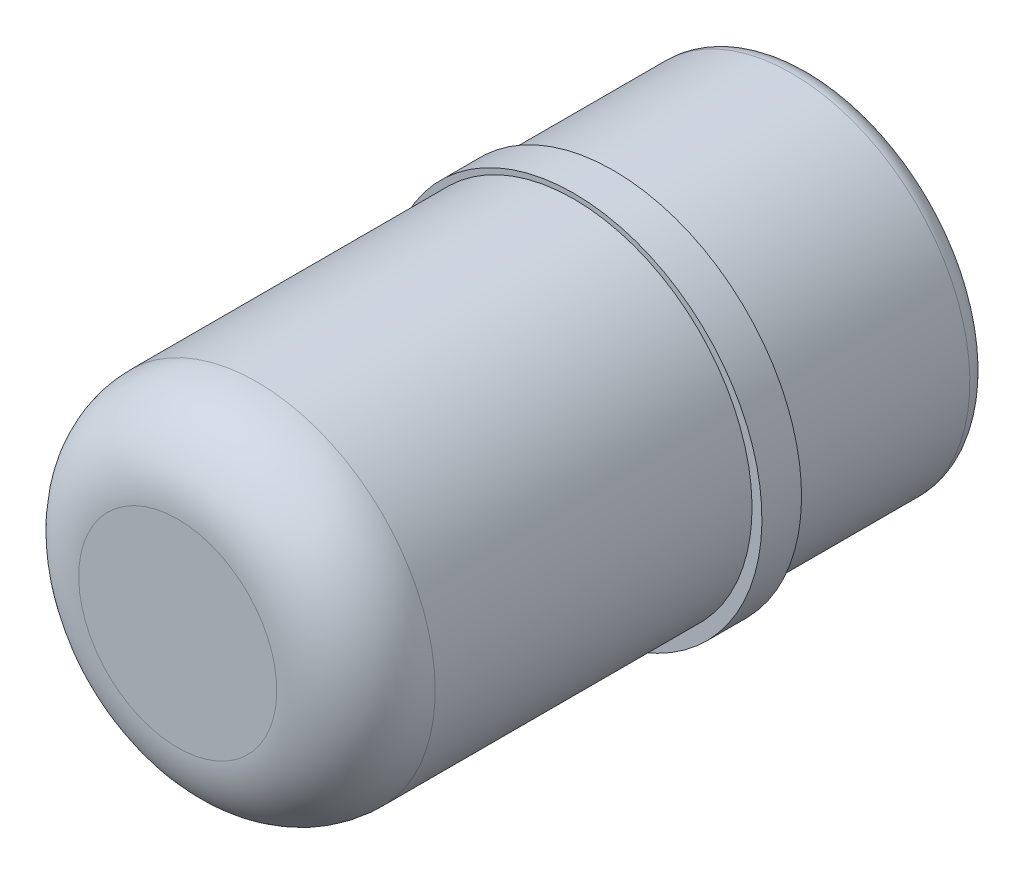
ISO-10303-21;
HEADER;
FILE_DESCRIPTION(('STEP AP214'),'2;1');
FILE_NAME('part.step','',(''),(''),'','','');
FILE_SCHEMA(('AUTOMOTIVE_DESIGN { 1 0 10303 214 1 1 1 1 }'));
ENDSEC;
DATA;
#1=APPLICATION_CONTEXT('core data for automotive mechanical design processes');
#2=APPLICATION_PROTOCOL_DEFINITION('international standard','automotive_design',2000,#1);
#3=PRODUCT_CONTEXT('',#1,'mechanical');
#4=PRODUCT('Part','Part','',(#3));
#5=PRODUCT_RELATED_PRODUCT_CATEGORY('part','',(#4));
#6=PRODUCT_DEFINITION_FORMATION('','',#4);
#7=PRODUCT_DEFINITION_CONTEXT('part definition',#1,'design');
#8=PRODUCT_DEFINITION('design','',#6,#7);
#9=PRODUCT_DEFINITION_SHAPE('','',#8);
#10=(LENGTH_UNIT() NAMED_UNIT(*) SI_UNIT(.MILLI.,.METRE.));
#11=(NAMED_UNIT(*) PLANE_ANGLE_UNIT() SI_UNIT($,.RADIAN.));
#12=(NAMED_UNIT(*) SI_UNIT($,.STERADIAN.) SOLID_ANGLE_UNIT());
#13=UNCERTAINTY_MEASURE_WITH_UNIT(LENGTH_MEASURE(1.E-05),#10,'distance_accuracy_value','');
#14=(GEOMETRIC_REPRESENTATION_CONTEXT(3) GLOBAL_UNCERTAINTY_ASSIGNED_CONTEXT((#13)) GLOBAL_UNIT_ASSIGNED_CONTEXT((#10,
#11,#12)) REPRESENTATION_CONTEXT('',''));
#15=CARTESIAN_POINT('',(0.,0.,0.));
#16=DIRECTION('',(0.,0.,1.));
#17=DIRECTION('',(1.,0.,0.));
#18=AXIS2_PLACEMENT_3D('',#15,#16,#17);
#19=CARTESIAN_POINT('',(0.,-22.5,4.99999999999999));
#20=DIRECTION('',(0.,0.,-1.));
#21=DIRECTION('',(0.,1.,0.));
#22=AXIS2_PLACEMENT_3D('',#19,#20,#21);
#23=CYLINDRICAL_SURFACE('',#22,45.);
#24=CARTESIAN_POINT('',(0.,-22.5,85.));
#25=DIRECTION('',(0.,0.,-1.));
#26=DIRECTION('',(0.,1.,0.));
#27=AXIS2_PLACEMENT_3D('',#24,#25,#26);
#28=CIRCLE('',#27,45.);
#29=CARTESIAN_POINT('',(0.,22.5,85.));
#30=VERTEX_POINT('',#29);
#31=EDGE_CURVE('E53',#30,#30,#28,.T.);
#32=ORIENTED_EDGE('',*,*,#31,.T.);
#33=EDGE_LOOP('',(#32));
#34=FACE_BOUND('',#33,.T.);
#35=CARTESIAN_POINT('',(0.,-22.5,4.99999999999998));
#36=DIRECTION('',(0.,0.,-1.));
#37=DIRECTION('',(0.,1.,0.));
#38=AXIS2_PLACEMENT_3D('',#35,#36,#37);
#39=CIRCLE('',#38,45.);
#40=CARTESIAN_POINT('',(0.,22.5,5.));
#41=VERTEX_POINT('',#40);
#42=EDGE_CURVE('E58',#41,#41,#39,.T.);
#43=ORIENTED_EDGE('',*,*,#42,.F.);
#44=EDGE_LOOP('',(#43));
#45=FACE_BOUND('',#44,.T.);
#46=ADVANCED_FACE('F39',(#34,#45),#23,.T.);
#47=CARTESIAN_POINT('',(0.,0.,105.));
#48=DIRECTION('',(0.,0.,-1.));
#49=DIRECTION('',(0.,1.,0.));
#50=AXIS2_PLACEMENT_3D('',#47,#48,#49);
#51=PLANE('',#50);
#52=CARTESIAN_POINT('',(0.,-22.5,105.));
#53=DIRECTION('',(0.,0.,-1.));
#54=DIRECTION('',(0.,1.,0.));
#55=AXIS2_PLACEMENT_3D('',#52,#53,#54);
#56=CIRCLE('',#55,25.);
#57=CARTESIAN_POINT('',(0.,2.49999999999998,105.));
#58=VERTEX_POINT('',#57);
#59=EDGE_CURVE('E49',#58,#58,#56,.F.);
#60=ORIENTED_EDGE('',*,*,#59,.T.);
#61=EDGE_LOOP('',(#60));
#62=FACE_BOUND('',#61,.T.);
#63=ADVANCED_FACE('F76',(#62),#51,.F.);
#64=CARTESIAN_POINT('',(0.,0.,-5.));
#65=DIRECTION('',(0.,0.,-1.));
#66=DIRECTION('',(0.,1.,0.));
#67=AXIS2_PLACEMENT_3D('',#64,#65,#66);
#68=PLANE('',#67);
#69=CARTESIAN_POINT('',(0.,-22.5,-5.00000000000002));
#70=DIRECTION('',(0.,0.,-1.));
#71=DIRECTION('',(0.,1.,0.));
#72=AXIS2_PLACEMENT_3D('',#69,#70,#71);
#73=CIRCLE('',#72,45.);
#74=CARTESIAN_POINT('',(0.,22.5,-5.));
#75=VERTEX_POINT('',#74);
#76=EDGE_CURVE('E56',#75,#75,#73,.T.);
#77=ORIENTED_EDGE('',*,*,#76,.F.);
#78=EDGE_LOOP('',(#77));
#79=FACE_BOUND('',#78,.T.);
#80=CARTESIAN_POINT('',(0.,-23.75,-5.00000000000003));
#81=DIRECTION('',(0.,0.,-1.));
#82=DIRECTION('',(0.,1.,0.));
#83=AXIS2_PLACEMENT_3D('',#80,#81,#82);
#84=CIRCLE('',#83,47.5);
#85=CARTESIAN_POINT('',(0.,23.75,-5.));
#86=VERTEX_POINT('',#85);
#87=EDGE_CURVE('E61',#86,#86,#84,.T.);
#88=ORIENTED_EDGE('',*,*,#87,.T.);
#89=EDGE_LOOP('',(#88));
#90=FACE_BOUND('',#89,.T.);
#91=ADVANCED_FACE('F74',(#79,#90),#68,.T.);
#92=CARTESIAN_POINT('',(0.,-23.75,-5.));
#93=DIRECTION('',(0.,0.,-1.));
#94=DIRECTION('',(0.,1.,0.));
#95=AXIS2_PLACEMENT_3D('',#92,#93,#94);
#96=CYLINDRICAL_SURFACE('',#95,47.5);
#97=CARTESIAN_POINT('',(0.,-23.75,4.99999999999997));
#98=DIRECTION('',(0.,0.,-1.));
#99=DIRECTION('',(0.,1.,0.));
#100=AXIS2_PLACEMENT_3D('',#97,#98,#99);
#101=CIRCLE('',#100,47.5);
#102=CARTESIAN_POINT('',(0.,23.75,5.));
#103=VERTEX_POINT('',#102);
#104=EDGE_CURVE('E66',#103,#103,#101,.T.);
#105=ORIENTED_EDGE('',*,*,#104,.T.);
#106=EDGE_LOOP('',(#105));
#107=FACE_BOUND('',#106,.T.);
#108=ORIENTED_EDGE('',*,*,#87,.F.);
#109=EDGE_LOOP('',(#108));
#110=FACE_BOUND('',#109,.T.);
#111=ADVANCED_FACE('F80',(#107,#110),#96,.T.);
#112=CARTESIAN_POINT('',(0.,0.,5.));
#113=DIRECTION('',(0.,0.,-1.));
#114=DIRECTION('',(0.,1.,0.));
#115=AXIS2_PLACEMENT_3D('',#112,#113,#114);
#116=PLANE('',#115);
#117=ORIENTED_EDGE('',*,*,#42,.T.);
#118=EDGE_LOOP('',(#117));
#119=FACE_BOUND('',#118,.T.);
#120=ORIENTED_EDGE('',*,*,#104,.F.);
#121=EDGE_LOOP('',(#120));
#122=FACE_BOUND('',#121,.T.);
#123=ADVANCED_FACE('F83',(#119,#122),#116,.F.);
#124=CARTESIAN_POINT('',(0.,0.,-55.));
#125=DIRECTION('',(0.,0.,-1.));
#126=DIRECTION('',(0.,1.,0.));
#127=AXIS2_PLACEMENT_3D('',#124,#125,#126);
#128=PLANE('',#127);
#129=CARTESIAN_POINT('',(0.,-22.5,-55.));
#130=DIRECTION('',(0.,0.,-1.));
#131=DIRECTION('',(0.,1.,0.));
#132=AXIS2_PLACEMENT_3D('',#129,#130,#131);
#133=CIRCLE('',#132,40.);
#134=CARTESIAN_POINT('',(0.,17.5,-55.));
#135=VERTEX_POINT('',#134);
#136=EDGE_CURVE('E46',#135,#135,#133,.T.);
#137=ORIENTED_EDGE('',*,*,#136,.T.);
#138=EDGE_LOOP('',(#137));
#139=FACE_BOUND('',#138,.T.);
#140=ADVANCED_FACE('F90',(#139),#128,.T.);
#141=CARTESIAN_POINT('',(0.,-22.5,-55.));
#142=DIRECTION('',(0.,0.,-1.));
#143=DIRECTION('',(0.,1.,0.));
#144=AXIS2_PLACEMENT_3D('',#141,#142,#143);
#145=CYLINDRICAL_SURFACE('',#144,45.);
#146=CARTESIAN_POINT('',(0.,-22.5,-50.));
#147=DIRECTION('',(0.,0.,-1.));
#148=DIRECTION('',(0.,1.,0.));
#149=AXIS2_PLACEMENT_3D('',#146,#147,#148);
#150=CIRCLE('',#149,45.);
#151=CARTESIAN_POINT('',(0.,22.5,-50.));
#152=VERTEX_POINT('',#151);
#153=EDGE_CURVE('E10',#152,#152,#150,.F.);
#154=ORIENTED_EDGE('',*,*,#153,.T.);
#155=EDGE_LOOP('',(#154));
#156=FACE_BOUND('',#155,.T.);
#157=ORIENTED_EDGE('',*,*,#76,.T.);
#158=EDGE_LOOP('',(#157));
#159=FACE_BOUND('',#158,.T.);
#160=ADVANCED_FACE('F75',(#156,#159),#145,.T.);
#161=CARTESIAN_POINT('',(0.,-22.5,85.));
#162=DIRECTION('',(0.,0.,-1.));
#163=DIRECTION('',(0.,1.,0.));
#164=AXIS2_PLACEMENT_3D('',#161,#162,#163);
#165=TOROIDAL_SURFACE('',#164,25.,20.);
#166=ORIENTED_EDGE('',*,*,#59,.F.);
#167=EDGE_LOOP('',(#166));
#168=FACE_BOUND('',#167,.T.);
#169=ORIENTED_EDGE('',*,*,#31,.F.);
#170=EDGE_LOOP('',(#169));
#171=FACE_BOUND('',#170,.T.);
#172=ADVANCED_FACE('F101',(#168,#171),#165,.T.);
#173=CARTESIAN_POINT('',(0.,-22.5,-50.));
#174=DIRECTION('',(0.,0.,-1.));
#175=DIRECTION('',(0.,1.,0.));
#176=AXIS2_PLACEMENT_3D('',#173,#174,#175);
#177=TOROIDAL_SURFACE('',#176,40.,5.);
#178=ORIENTED_EDGE('',*,*,#153,.F.);
#179=EDGE_LOOP('',(#178));
#180=FACE_BOUND('',#179,.T.);
#181=ORIENTED_EDGE('',*,*,#136,.F.);
#182=EDGE_LOOP('',(#181));
#183=FACE_BOUND('',#182,.T.);
#184=ADVANCED_FACE('F41',(#180,#183),#177,.T.);
#185=CLOSED_SHELL('',(#46,#63,#91,#111,#123,#140,#160,#172,#184));
#186=MANIFOLD_SOLID_BREP('B2',#185);
#187=ADVANCED_BREP_SHAPE_REPRESENTATION('',(#18,#186),#14);
#188=SHAPE_DEFINITION_REPRESENTATION(#9,#187);
ENDSEC;
END-ISO-10303-21;
